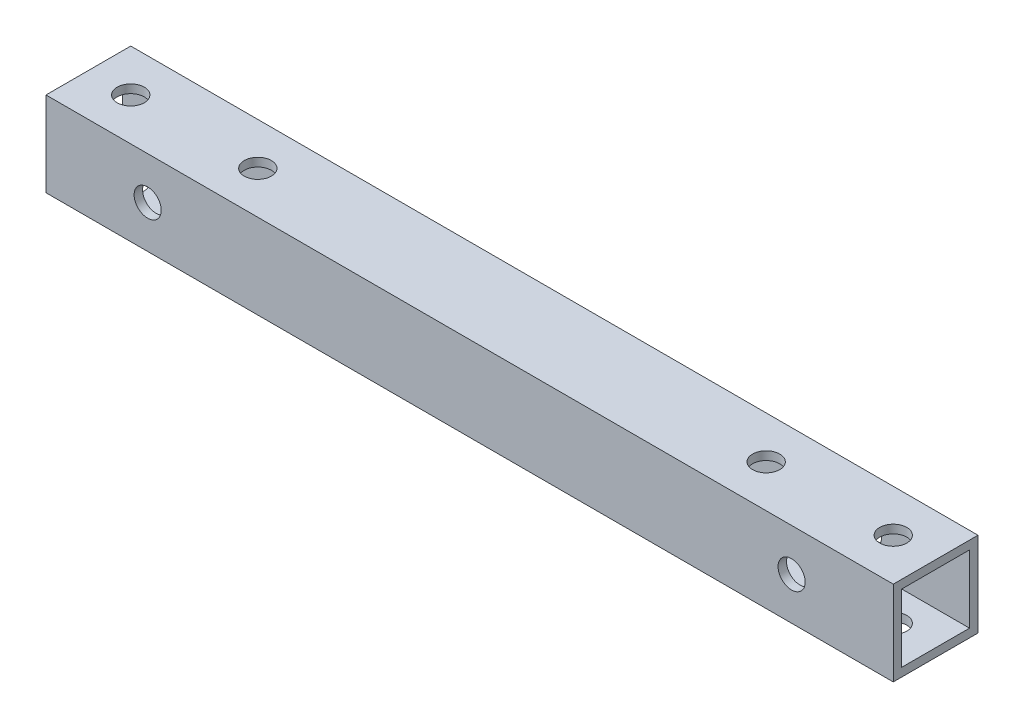
ISO-10303-21;
HEADER;
FILE_DESCRIPTION(('STEP AP214'),'2;1');
FILE_NAME('part.step','',(''),(''),'','','');
FILE_SCHEMA(('AUTOMOTIVE_DESIGN { 1 0 10303 214 1 1 1 1 }'));
ENDSEC;
DATA;
#1=APPLICATION_CONTEXT('core data for automotive mechanical design processes');
#2=APPLICATION_PROTOCOL_DEFINITION('international standard','automotive_design',2000,#1);
#3=PRODUCT_CONTEXT('',#1,'mechanical');
#4=PRODUCT('Part','Part','',(#3));
#5=PRODUCT_RELATED_PRODUCT_CATEGORY('part','',(#4));
#6=PRODUCT_DEFINITION_FORMATION('','',#4);
#7=PRODUCT_DEFINITION_CONTEXT('part definition',#1,'design');
#8=PRODUCT_DEFINITION('design','',#6,#7);
#9=PRODUCT_DEFINITION_SHAPE('','',#8);
#10=(LENGTH_UNIT() NAMED_UNIT(*) SI_UNIT(.MILLI.,.METRE.));
#11=(NAMED_UNIT(*) PLANE_ANGLE_UNIT() SI_UNIT($,.RADIAN.));
#12=(NAMED_UNIT(*) SI_UNIT($,.STERADIAN.) SOLID_ANGLE_UNIT());
#13=UNCERTAINTY_MEASURE_WITH_UNIT(LENGTH_MEASURE(1.E-05),#10,'distance_accuracy_value','');
#14=(GEOMETRIC_REPRESENTATION_CONTEXT(3) GLOBAL_UNCERTAINTY_ASSIGNED_CONTEXT((#13)) GLOBAL_UNIT_ASSIGNED_CONTEXT((#10,
#11,#12)) REPRESENTATION_CONTEXT('',''));
#15=CARTESIAN_POINT('',(0.,0.,0.));
#16=DIRECTION('',(0.,0.,1.));
#17=DIRECTION('',(1.,0.,0.));
#18=AXIS2_PLACEMENT_3D('',#15,#16,#17);
#19=CARTESIAN_POINT('',(50.,5.,-5.));
#20=DIRECTION('',(0.,0.,1.));
#21=DIRECTION('',(1.,0.,0.));
#22=AXIS2_PLACEMENT_3D('',#19,#20,#21);
#23=PLANE('',#22);
#24=CARTESIAN_POINT('',(-38.,0.,-5.));
#25=DIRECTION('',(0.,0.,1.));
#26=DIRECTION('',(1.,0.,0.));
#27=AXIS2_PLACEMENT_3D('',#24,#25,#26);
#28=CIRCLE('',#27,1.6);
#29=CARTESIAN_POINT('',(-36.4,0.,-5.));
#30=VERTEX_POINT('',#29);
#31=EDGE_CURVE('E185',#30,#30,#28,.T.);
#32=ORIENTED_EDGE('',*,*,#31,.T.);
#33=EDGE_LOOP('',(#32));
#34=FACE_BOUND('',#33,.T.);
#35=CARTESIAN_POINT('',(38.,0.,-5.));
#36=DIRECTION('',(0.,0.,1.));
#37=DIRECTION('',(-1.,0.,0.));
#38=AXIS2_PLACEMENT_3D('',#35,#36,#37);
#39=CIRCLE('',#38,1.6);
#40=CARTESIAN_POINT('',(36.4,0.,-5.));
#41=VERTEX_POINT('',#40);
#42=EDGE_CURVE('E196',#41,#41,#39,.T.);
#43=ORIENTED_EDGE('',*,*,#42,.T.);
#44=EDGE_LOOP('',(#43));
#45=FACE_BOUND('',#44,.T.);
#46=DIRECTION('',(0.,1.,0.));
#47=VECTOR('',#46,1.);
#48=CARTESIAN_POINT('',(-50.,5.,-5.));
#49=LINE('',#48,#47);
#50=CARTESIAN_POINT('',(-50.,-5.,-5.));
#51=VERTEX_POINT('',#50);
#52=CARTESIAN_POINT('',(-50.,5.,-5.));
#53=VERTEX_POINT('',#52);
#54=EDGE_CURVE('E138',#51,#53,#49,.T.);
#55=ORIENTED_EDGE('',*,*,#54,.T.);
#56=DIRECTION('',(-1.,0.,0.));
#57=VECTOR('',#56,1.);
#58=CARTESIAN_POINT('',(50.,5.,-5.));
#59=LINE('',#58,#57);
#60=CARTESIAN_POINT('',(50.,5.,-5.));
#61=VERTEX_POINT('',#60);
#62=EDGE_CURVE('E11',#61,#53,#59,.T.);
#63=ORIENTED_EDGE('',*,*,#62,.F.);
#64=DIRECTION('',(0.,1.,0.));
#65=VECTOR('',#64,1.);
#66=CARTESIAN_POINT('',(50.,5.,-5.));
#67=LINE('',#66,#65);
#68=CARTESIAN_POINT('',(50.,-5.,-5.));
#69=VERTEX_POINT('',#68);
#70=EDGE_CURVE('E142',#69,#61,#67,.T.);
#71=ORIENTED_EDGE('',*,*,#70,.F.);
#72=DIRECTION('',(-1.,0.,0.));
#73=VECTOR('',#72,1.);
#74=CARTESIAN_POINT('',(50.,-5.,-5.));
#75=LINE('',#74,#73);
#76=EDGE_CURVE('E152',#69,#51,#75,.T.);
#77=ORIENTED_EDGE('',*,*,#76,.T.);
#78=EDGE_LOOP('',(#55,#63,#71,#77));
#79=FACE_BOUND('',#78,.T.);
#80=ADVANCED_FACE('F36',(#34,#45,#79),#23,.F.);
#81=CARTESIAN_POINT('',(50.,5.,5.));
#82=DIRECTION('',(0.,-1.,0.));
#83=DIRECTION('',(0.,0.,-1.));
#84=AXIS2_PLACEMENT_3D('',#81,#82,#83);
#85=PLANE('',#84);
#86=CARTESIAN_POINT('',(-45.,5.,0.));
#87=DIRECTION('',(0.,1.,0.));
#88=DIRECTION('',(0.,0.,1.));
#89=AXIS2_PLACEMENT_3D('',#86,#87,#88);
#90=CIRCLE('',#89,1.60000000000001);
#91=CARTESIAN_POINT('',(-45.,5.,1.60000000000001));
#92=VERTEX_POINT('',#91);
#93=EDGE_CURVE('E210',#92,#92,#90,.T.);
#94=ORIENTED_EDGE('',*,*,#93,.F.);
#95=EDGE_LOOP('',(#94));
#96=FACE_BOUND('',#95,.T.);
#97=CARTESIAN_POINT('',(-30.,5.,0.));
#98=DIRECTION('',(0.,1.,0.));
#99=DIRECTION('',(0.,0.,1.));
#100=AXIS2_PLACEMENT_3D('',#97,#98,#99);
#101=CIRCLE('',#100,1.60000000000001);
#102=CARTESIAN_POINT('',(-30.,5.,1.60000000000001));
#103=VERTEX_POINT('',#102);
#104=EDGE_CURVE('E216',#103,#103,#101,.T.);
#105=ORIENTED_EDGE('',*,*,#104,.F.);
#106=EDGE_LOOP('',(#105));
#107=FACE_BOUND('',#106,.T.);
#108=CARTESIAN_POINT('',(30.,5.,0.));
#109=DIRECTION('',(0.,1.,0.));
#110=DIRECTION('',(0.,0.,-1.));
#111=AXIS2_PLACEMENT_3D('',#108,#109,#110);
#112=CIRCLE('',#111,1.60000000000001);
#113=CARTESIAN_POINT('',(30.,5.,-1.60000000000001));
#114=VERTEX_POINT('',#113);
#115=EDGE_CURVE('E222',#114,#114,#112,.T.);
#116=ORIENTED_EDGE('',*,*,#115,.F.);
#117=EDGE_LOOP('',(#116));
#118=FACE_BOUND('',#117,.T.);
#119=CARTESIAN_POINT('',(45.,5.,0.));
#120=DIRECTION('',(0.,1.,0.));
#121=DIRECTION('',(0.,0.,-1.));
#122=AXIS2_PLACEMENT_3D('',#119,#120,#121);
#123=CIRCLE('',#122,1.60000000000001);
#124=CARTESIAN_POINT('',(45.,5.,-1.60000000000001));
#125=VERTEX_POINT('',#124);
#126=EDGE_CURVE('E207',#125,#125,#123,.T.);
#127=ORIENTED_EDGE('',*,*,#126,.F.);
#128=EDGE_LOOP('',(#127));
#129=FACE_BOUND('',#128,.T.);
#130=DIRECTION('',(0.,0.,1.));
#131=VECTOR('',#130,1.);
#132=CARTESIAN_POINT('',(-50.,5.,5.));
#133=LINE('',#132,#131);
#134=CARTESIAN_POINT('',(-50.,5.,5.));
#135=VERTEX_POINT('',#134);
#136=EDGE_CURVE('E155',#53,#135,#133,.T.);
#137=ORIENTED_EDGE('',*,*,#136,.T.);
#138=DIRECTION('',(-1.,0.,0.));
#139=VECTOR('',#138,1.);
#140=CARTESIAN_POINT('',(50.,5.,5.));
#141=LINE('',#140,#139);
#142=CARTESIAN_POINT('',(50.,5.,5.));
#143=VERTEX_POINT('',#142);
#144=EDGE_CURVE('E44',#143,#135,#141,.T.);
#145=ORIENTED_EDGE('',*,*,#144,.F.);
#146=DIRECTION('',(0.,0.,1.));
#147=VECTOR('',#146,1.);
#148=CARTESIAN_POINT('',(50.,5.,5.));
#149=LINE('',#148,#147);
#150=EDGE_CURVE('E145',#61,#143,#149,.T.);
#151=ORIENTED_EDGE('',*,*,#150,.F.);
#152=ORIENTED_EDGE('',*,*,#62,.T.);
#153=EDGE_LOOP('',(#137,#145,#151,#152));
#154=FACE_BOUND('',#153,.T.);
#155=ADVANCED_FACE('F262',(#96,#107,#118,#129,#154),#85,.F.);
#156=CARTESIAN_POINT('',(50.,5.,5.));
#157=DIRECTION('',(0.,0.,-1.));
#158=DIRECTION('',(0.,1.,0.));
#159=AXIS2_PLACEMENT_3D('',#156,#157,#158);
#160=PLANE('',#159);
#161=CARTESIAN_POINT('',(-38.,0.,5.));
#162=DIRECTION('',(0.,0.,1.));
#163=DIRECTION('',(1.,0.,0.));
#164=AXIS2_PLACEMENT_3D('',#161,#162,#163);
#165=CIRCLE('',#164,1.6);
#166=CARTESIAN_POINT('',(-36.4,0.,5.));
#167=VERTEX_POINT('',#166);
#168=EDGE_CURVE('E191',#167,#167,#165,.T.);
#169=ORIENTED_EDGE('',*,*,#168,.F.);
#170=EDGE_LOOP('',(#169));
#171=FACE_BOUND('',#170,.T.);
#172=CARTESIAN_POINT('',(38.,0.,5.));
#173=DIRECTION('',(0.,0.,1.));
#174=DIRECTION('',(-1.,0.,0.));
#175=AXIS2_PLACEMENT_3D('',#172,#173,#174);
#176=CIRCLE('',#175,1.6);
#177=CARTESIAN_POINT('',(36.4,0.,5.));
#178=VERTEX_POINT('',#177);
#179=EDGE_CURVE('E201',#178,#178,#176,.T.);
#180=ORIENTED_EDGE('',*,*,#179,.F.);
#181=EDGE_LOOP('',(#180));
#182=FACE_BOUND('',#181,.T.);
#183=DIRECTION('',(0.,-1.,0.));
#184=VECTOR('',#183,1.);
#185=CARTESIAN_POINT('',(-50.,5.,5.));
#186=LINE('',#185,#184);
#187=CARTESIAN_POINT('',(-50.,-5.,5.));
#188=VERTEX_POINT('',#187);
#189=EDGE_CURVE('E157',#135,#188,#186,.T.);
#190=ORIENTED_EDGE('',*,*,#189,.T.);
#191=DIRECTION('',(-1.,0.,0.));
#192=VECTOR('',#191,1.);
#193=CARTESIAN_POINT('',(50.,-5.,5.));
#194=LINE('',#193,#192);
#195=CARTESIAN_POINT('',(50.,-5.,5.));
#196=VERTEX_POINT('',#195);
#197=EDGE_CURVE('E162',#196,#188,#194,.T.);
#198=ORIENTED_EDGE('',*,*,#197,.F.);
#199=DIRECTION('',(0.,-1.,0.));
#200=VECTOR('',#199,1.);
#201=CARTESIAN_POINT('',(50.,5.,5.));
#202=LINE('',#201,#200);
#203=EDGE_CURVE('E148',#143,#196,#202,.T.);
#204=ORIENTED_EDGE('',*,*,#203,.F.);
#205=ORIENTED_EDGE('',*,*,#144,.T.);
#206=EDGE_LOOP('',(#190,#198,#204,#205));
#207=FACE_BOUND('',#206,.T.);
#208=ADVANCED_FACE('F268',(#171,#182,#207),#160,.F.);
#209=CARTESIAN_POINT('',(50.,-5.,5.));
#210=DIRECTION('',(0.,1.,0.));
#211=DIRECTION('',(0.,0.,1.));
#212=AXIS2_PLACEMENT_3D('',#209,#210,#211);
#213=PLANE('',#212);
#214=CARTESIAN_POINT('',(-45.,-5.,0.));
#215=DIRECTION('',(0.,1.,0.));
#216=DIRECTION('',(0.,0.,1.));
#217=AXIS2_PLACEMENT_3D('',#214,#215,#216);
#218=CIRCLE('',#217,1.60000000000001);
#219=CARTESIAN_POINT('',(-45.,-5.,1.60000000000001));
#220=VERTEX_POINT('',#219);
#221=EDGE_CURVE('E171',#220,#220,#218,.T.);
#222=ORIENTED_EDGE('',*,*,#221,.T.);
#223=EDGE_LOOP('',(#222));
#224=FACE_BOUND('',#223,.T.);
#225=CARTESIAN_POINT('',(-30.,-5.,0.));
#226=DIRECTION('',(0.,1.,0.));
#227=DIRECTION('',(0.,0.,1.));
#228=AXIS2_PLACEMENT_3D('',#225,#226,#227);
#229=CIRCLE('',#228,1.60000000000001);
#230=CARTESIAN_POINT('',(-30.,-5.,1.60000000000001));
#231=VERTEX_POINT('',#230);
#232=EDGE_CURVE('E213',#231,#231,#229,.T.);
#233=ORIENTED_EDGE('',*,*,#232,.T.);
#234=EDGE_LOOP('',(#233));
#235=FACE_BOUND('',#234,.T.);
#236=CARTESIAN_POINT('',(30.,-5.,0.));
#237=DIRECTION('',(0.,1.,0.));
#238=DIRECTION('',(0.,0.,-1.));
#239=AXIS2_PLACEMENT_3D('',#236,#237,#238);
#240=CIRCLE('',#239,1.60000000000001);
#241=CARTESIAN_POINT('',(30.,-5.,-1.60000000000001));
#242=VERTEX_POINT('',#241);
#243=EDGE_CURVE('E219',#242,#242,#240,.T.);
#244=ORIENTED_EDGE('',*,*,#243,.T.);
#245=EDGE_LOOP('',(#244));
#246=FACE_BOUND('',#245,.T.);
#247=CARTESIAN_POINT('',(45.,-5.,0.));
#248=DIRECTION('',(0.,1.,0.));
#249=DIRECTION('',(0.,0.,-1.));
#250=AXIS2_PLACEMENT_3D('',#247,#248,#249);
#251=CIRCLE('',#250,1.60000000000001);
#252=CARTESIAN_POINT('',(45.,-5.,-1.60000000000001));
#253=VERTEX_POINT('',#252);
#254=EDGE_CURVE('E225',#253,#253,#251,.T.);
#255=ORIENTED_EDGE('',*,*,#254,.T.);
#256=EDGE_LOOP('',(#255));
#257=FACE_BOUND('',#256,.T.);
#258=DIRECTION('',(0.,0.,-1.));
#259=VECTOR('',#258,1.);
#260=CARTESIAN_POINT('',(-50.,-5.,5.));
#261=LINE('',#260,#259);
#262=EDGE_CURVE('E146',#188,#51,#261,.T.);
#263=ORIENTED_EDGE('',*,*,#262,.T.);
#264=ORIENTED_EDGE('',*,*,#76,.F.);
#265=DIRECTION('',(0.,0.,-1.));
#266=VECTOR('',#265,1.);
#267=CARTESIAN_POINT('',(50.,-5.,5.));
#268=LINE('',#267,#266);
#269=EDGE_CURVE('E150',#196,#69,#268,.T.);
#270=ORIENTED_EDGE('',*,*,#269,.F.);
#271=ORIENTED_EDGE('',*,*,#197,.T.);
#272=EDGE_LOOP('',(#263,#264,#270,#271));
#273=FACE_BOUND('',#272,.T.);
#274=ADVANCED_FACE('F287',(#224,#235,#246,#257,#273),#213,.F.);
#275=CARTESIAN_POINT('',(50.,0.,0.));
#276=DIRECTION('',(1.,0.,0.));
#277=DIRECTION('',(0.,0.,-1.));
#278=AXIS2_PLACEMENT_3D('',#275,#276,#277);
#279=PLANE('',#278);
#280=DIRECTION('',(0.,1.,0.));
#281=VECTOR('',#280,1.);
#282=CARTESIAN_POINT('',(50.,4.,-4.));
#283=LINE('',#282,#281);
#284=CARTESIAN_POINT('',(50.,-4.,-4.));
#285=VERTEX_POINT('',#284);
#286=CARTESIAN_POINT('',(50.,4.,-4.));
#287=VERTEX_POINT('',#286);
#288=EDGE_CURVE('E52',#285,#287,#283,.T.);
#289=ORIENTED_EDGE('',*,*,#288,.F.);
#290=DIRECTION('',(0.,0.,-1.));
#291=VECTOR('',#290,1.);
#292=CARTESIAN_POINT('',(50.,-4.,4.));
#293=LINE('',#292,#291);
#294=CARTESIAN_POINT('',(50.,-4.,4.));
#295=VERTEX_POINT('',#294);
#296=EDGE_CURVE('E120',#295,#285,#293,.T.);
#297=ORIENTED_EDGE('',*,*,#296,.F.);
#298=DIRECTION('',(0.,-1.,0.));
#299=VECTOR('',#298,1.);
#300=CARTESIAN_POINT('',(50.,4.,4.));
#301=LINE('',#300,#299);
#302=CARTESIAN_POINT('',(50.,4.,4.));
#303=VERTEX_POINT('',#302);
#304=EDGE_CURVE('E123',#303,#295,#301,.T.);
#305=ORIENTED_EDGE('',*,*,#304,.F.);
#306=DIRECTION('',(0.,0.,1.));
#307=VECTOR('',#306,1.);
#308=CARTESIAN_POINT('',(50.,4.,4.));
#309=LINE('',#308,#307);
#310=EDGE_CURVE('E132',#287,#303,#309,.T.);
#311=ORIENTED_EDGE('',*,*,#310,.F.);
#312=EDGE_LOOP('',(#289,#297,#305,#311));
#313=FACE_BOUND('',#312,.T.);
#314=ORIENTED_EDGE('',*,*,#70,.T.);
#315=ORIENTED_EDGE('',*,*,#150,.T.);
#316=ORIENTED_EDGE('',*,*,#203,.T.);
#317=ORIENTED_EDGE('',*,*,#269,.T.);
#318=EDGE_LOOP('',(#314,#315,#316,#317));
#319=FACE_BOUND('',#318,.T.);
#320=ADVANCED_FACE('F283',(#313,#319),#279,.T.);
#321=CARTESIAN_POINT('',(-50.,0.,0.));
#322=DIRECTION('',(1.,0.,0.));
#323=DIRECTION('',(0.,0.,-1.));
#324=AXIS2_PLACEMENT_3D('',#321,#322,#323);
#325=PLANE('',#324);
#326=DIRECTION('',(0.,0.,-1.));
#327=VECTOR('',#326,1.);
#328=CARTESIAN_POINT('',(-50.,-4.,4.));
#329=LINE('',#328,#327);
#330=CARTESIAN_POINT('',(-50.,-4.,4.));
#331=VERTEX_POINT('',#330);
#332=CARTESIAN_POINT('',(-50.,-4.,-4.));
#333=VERTEX_POINT('',#332);
#334=EDGE_CURVE('E110',#331,#333,#329,.T.);
#335=ORIENTED_EDGE('',*,*,#334,.T.);
#336=DIRECTION('',(0.,1.,0.));
#337=VECTOR('',#336,1.);
#338=CARTESIAN_POINT('',(-50.,4.,-4.));
#339=LINE('',#338,#337);
#340=CARTESIAN_POINT('',(-50.,4.,-4.));
#341=VERTEX_POINT('',#340);
#342=EDGE_CURVE('E104',#333,#341,#339,.T.);
#343=ORIENTED_EDGE('',*,*,#342,.T.);
#344=DIRECTION('',(0.,0.,1.));
#345=VECTOR('',#344,1.);
#346=CARTESIAN_POINT('',(-50.,4.,4.));
#347=LINE('',#346,#345);
#348=CARTESIAN_POINT('',(-50.,4.,4.));
#349=VERTEX_POINT('',#348);
#350=EDGE_CURVE('E113',#341,#349,#347,.T.);
#351=ORIENTED_EDGE('',*,*,#350,.T.);
#352=DIRECTION('',(0.,-1.,0.));
#353=VECTOR('',#352,1.);
#354=CARTESIAN_POINT('',(-50.,4.,4.));
#355=LINE('',#354,#353);
#356=EDGE_CURVE('E60',#349,#331,#355,.T.);
#357=ORIENTED_EDGE('',*,*,#356,.T.);
#358=EDGE_LOOP('',(#335,#343,#351,#357));
#359=FACE_BOUND('',#358,.T.);
#360=ORIENTED_EDGE('',*,*,#54,.F.);
#361=ORIENTED_EDGE('',*,*,#262,.F.);
#362=ORIENTED_EDGE('',*,*,#189,.F.);
#363=ORIENTED_EDGE('',*,*,#136,.F.);
#364=EDGE_LOOP('',(#360,#361,#362,#363));
#365=FACE_BOUND('',#364,.T.);
#366=ADVANCED_FACE('F117',(#359,#365),#325,.F.);
#367=CARTESIAN_POINT('',(-50.,4.,-4.));
#368=DIRECTION('',(0.,0.,-1.));
#369=DIRECTION('',(-1.,0.,0.));
#370=AXIS2_PLACEMENT_3D('',#367,#368,#369);
#371=PLANE('',#370);
#372=CARTESIAN_POINT('',(-38.,0.,-4.));
#373=DIRECTION('',(0.,0.,-1.));
#374=DIRECTION('',(-1.,0.,0.));
#375=AXIS2_PLACEMENT_3D('',#372,#373,#374);
#376=CIRCLE('',#375,1.6);
#377=CARTESIAN_POINT('',(-39.6,0.,-4.));
#378=VERTEX_POINT('',#377);
#379=EDGE_CURVE('E204',#378,#378,#376,.T.);
#380=ORIENTED_EDGE('',*,*,#379,.T.);
#381=EDGE_LOOP('',(#380));
#382=FACE_BOUND('',#381,.T.);
#383=CARTESIAN_POINT('',(38.,0.,-4.));
#384=DIRECTION('',(0.,0.,-1.));
#385=DIRECTION('',(-1.,0.,0.));
#386=AXIS2_PLACEMENT_3D('',#383,#384,#385);
#387=CIRCLE('',#386,1.6);
#388=CARTESIAN_POINT('',(36.4,0.,-4.));
#389=VERTEX_POINT('',#388);
#390=EDGE_CURVE('E184',#389,#389,#387,.T.);
#391=ORIENTED_EDGE('',*,*,#390,.T.);
#392=EDGE_LOOP('',(#391));
#393=FACE_BOUND('',#392,.T.);
#394=ORIENTED_EDGE('',*,*,#288,.T.);
#395=DIRECTION('',(1.,0.,0.));
#396=VECTOR('',#395,1.);
#397=CARTESIAN_POINT('',(-50.,4.,-4.));
#398=LINE('',#397,#396);
#399=EDGE_CURVE('E100',#341,#287,#398,.T.);
#400=ORIENTED_EDGE('',*,*,#399,.F.);
#401=ORIENTED_EDGE('',*,*,#342,.F.);
#402=DIRECTION('',(1.,0.,0.));
#403=VECTOR('',#402,1.);
#404=CARTESIAN_POINT('',(-50.,-4.,-4.));
#405=LINE('',#404,#403);
#406=EDGE_CURVE('E136',#333,#285,#405,.T.);
#407=ORIENTED_EDGE('',*,*,#406,.T.);
#408=EDGE_LOOP('',(#394,#400,#401,#407));
#409=FACE_BOUND('',#408,.T.);
#410=ADVANCED_FACE('F102',(#382,#393,#409),#371,.F.);
#411=CARTESIAN_POINT('',(-50.,-4.,4.));
#412=DIRECTION('',(0.,-1.,0.));
#413=DIRECTION('',(0.,0.,-1.));
#414=AXIS2_PLACEMENT_3D('',#411,#412,#413);
#415=PLANE('',#414);
#416=CARTESIAN_POINT('',(-45.,-4.,0.));
#417=DIRECTION('',(0.,-1.,0.));
#418=DIRECTION('',(0.,0.,-1.));
#419=AXIS2_PLACEMENT_3D('',#416,#417,#418);
#420=CIRCLE('',#419,1.60000000000001);
#421=CARTESIAN_POINT('',(-45.,-4.,-1.60000000000001));
#422=VERTEX_POINT('',#421);
#423=EDGE_CURVE('E126',#422,#422,#420,.T.);
#424=ORIENTED_EDGE('',*,*,#423,.T.);
#425=EDGE_LOOP('',(#424));
#426=FACE_BOUND('',#425,.T.);
#427=CARTESIAN_POINT('',(-30.,-4.,0.));
#428=DIRECTION('',(0.,-1.,0.));
#429=DIRECTION('',(0.,0.,-1.));
#430=AXIS2_PLACEMENT_3D('',#427,#428,#429);
#431=CIRCLE('',#430,1.60000000000001);
#432=CARTESIAN_POINT('',(-30.,-4.,-1.60000000000001));
#433=VERTEX_POINT('',#432);
#434=EDGE_CURVE('E179',#433,#433,#431,.T.);
#435=ORIENTED_EDGE('',*,*,#434,.T.);
#436=EDGE_LOOP('',(#435));
#437=FACE_BOUND('',#436,.T.);
#438=CARTESIAN_POINT('',(30.,-4.,0.));
#439=DIRECTION('',(0.,-1.,0.));
#440=DIRECTION('',(0.,0.,-1.));
#441=AXIS2_PLACEMENT_3D('',#438,#439,#440);
#442=CIRCLE('',#441,1.60000000000001);
#443=CARTESIAN_POINT('',(30.,-4.,-1.60000000000001));
#444=VERTEX_POINT('',#443);
#445=EDGE_CURVE('E175',#444,#444,#442,.T.);
#446=ORIENTED_EDGE('',*,*,#445,.T.);
#447=EDGE_LOOP('',(#446));
#448=FACE_BOUND('',#447,.T.);
#449=CARTESIAN_POINT('',(45.,-4.,0.));
#450=DIRECTION('',(0.,-1.,0.));
#451=DIRECTION('',(0.,0.,-1.));
#452=AXIS2_PLACEMENT_3D('',#449,#450,#451);
#453=CIRCLE('',#452,1.60000000000001);
#454=CARTESIAN_POINT('',(45.,-4.,-1.60000000000001));
#455=VERTEX_POINT('',#454);
#456=EDGE_CURVE('E170',#455,#455,#453,.T.);
#457=ORIENTED_EDGE('',*,*,#456,.T.);
#458=EDGE_LOOP('',(#457));
#459=FACE_BOUND('',#458,.T.);
#460=ORIENTED_EDGE('',*,*,#296,.T.);
#461=ORIENTED_EDGE('',*,*,#406,.F.);
#462=ORIENTED_EDGE('',*,*,#334,.F.);
#463=DIRECTION('',(1.,0.,0.));
#464=VECTOR('',#463,1.);
#465=CARTESIAN_POINT('',(-50.,-4.,4.));
#466=LINE('',#465,#464);
#467=EDGE_CURVE('E139',#331,#295,#466,.T.);
#468=ORIENTED_EDGE('',*,*,#467,.T.);
#469=EDGE_LOOP('',(#460,#461,#462,#468));
#470=FACE_BOUND('',#469,.T.);
#471=ADVANCED_FACE('F236',(#426,#437,#448,#459,#470),#415,.F.);
#472=CARTESIAN_POINT('',(-50.,4.,4.));
#473=DIRECTION('',(0.,0.,1.));
#474=DIRECTION('',(1.,0.,0.));
#475=AXIS2_PLACEMENT_3D('',#472,#473,#474);
#476=PLANE('',#475);
#477=CARTESIAN_POINT('',(-38.,0.,4.));
#478=DIRECTION('',(0.,0.,1.));
#479=DIRECTION('',(1.,0.,0.));
#480=AXIS2_PLACEMENT_3D('',#477,#478,#479);
#481=CIRCLE('',#480,1.6);
#482=CARTESIAN_POINT('',(-36.4,0.,4.));
#483=VERTEX_POINT('',#482);
#484=EDGE_CURVE('E39',#483,#483,#481,.T.);
#485=ORIENTED_EDGE('',*,*,#484,.T.);
#486=EDGE_LOOP('',(#485));
#487=FACE_BOUND('',#486,.T.);
#488=CARTESIAN_POINT('',(38.,0.,4.));
#489=DIRECTION('',(0.,0.,1.));
#490=DIRECTION('',(1.,0.,0.));
#491=AXIS2_PLACEMENT_3D('',#488,#489,#490);
#492=CIRCLE('',#491,1.6);
#493=CARTESIAN_POINT('',(39.6,0.,4.));
#494=VERTEX_POINT('',#493);
#495=EDGE_CURVE('E182',#494,#494,#492,.T.);
#496=ORIENTED_EDGE('',*,*,#495,.T.);
#497=EDGE_LOOP('',(#496));
#498=FACE_BOUND('',#497,.T.);
#499=ORIENTED_EDGE('',*,*,#304,.T.);
#500=ORIENTED_EDGE('',*,*,#467,.F.);
#501=ORIENTED_EDGE('',*,*,#356,.F.);
#502=DIRECTION('',(1.,0.,0.));
#503=VECTOR('',#502,1.);
#504=CARTESIAN_POINT('',(-50.,4.,4.));
#505=LINE('',#504,#503);
#506=EDGE_CURVE('E109',#349,#303,#505,.T.);
#507=ORIENTED_EDGE('',*,*,#506,.T.);
#508=EDGE_LOOP('',(#499,#500,#501,#507));
#509=FACE_BOUND('',#508,.T.);
#510=ADVANCED_FACE('F310',(#487,#498,#509),#476,.F.);
#511=CARTESIAN_POINT('',(-50.,4.,4.));
#512=DIRECTION('',(0.,1.,0.));
#513=DIRECTION('',(0.,0.,1.));
#514=AXIS2_PLACEMENT_3D('',#511,#512,#513);
#515=PLANE('',#514);
#516=CARTESIAN_POINT('',(-45.,4.,0.));
#517=DIRECTION('',(0.,1.,0.));
#518=DIRECTION('',(0.,0.,1.));
#519=AXIS2_PLACEMENT_3D('',#516,#517,#518);
#520=CIRCLE('',#519,1.60000000000001);
#521=CARTESIAN_POINT('',(-45.,4.,1.60000000000001));
#522=VERTEX_POINT('',#521);
#523=EDGE_CURVE('E180',#522,#522,#520,.T.);
#524=ORIENTED_EDGE('',*,*,#523,.T.);
#525=EDGE_LOOP('',(#524));
#526=FACE_BOUND('',#525,.T.);
#527=CARTESIAN_POINT('',(-30.,4.,0.));
#528=DIRECTION('',(0.,1.,0.));
#529=DIRECTION('',(0.,0.,1.));
#530=AXIS2_PLACEMENT_3D('',#527,#528,#529);
#531=CIRCLE('',#530,1.60000000000001);
#532=CARTESIAN_POINT('',(-30.,4.,1.60000000000001));
#533=VERTEX_POINT('',#532);
#534=EDGE_CURVE('E176',#533,#533,#531,.T.);
#535=ORIENTED_EDGE('',*,*,#534,.T.);
#536=EDGE_LOOP('',(#535));
#537=FACE_BOUND('',#536,.T.);
#538=CARTESIAN_POINT('',(30.,4.,0.));
#539=DIRECTION('',(0.,1.,0.));
#540=DIRECTION('',(0.,0.,1.));
#541=AXIS2_PLACEMENT_3D('',#538,#539,#540);
#542=CIRCLE('',#541,1.60000000000001);
#543=CARTESIAN_POINT('',(30.,4.,1.60000000000001));
#544=VERTEX_POINT('',#543);
#545=EDGE_CURVE('E172',#544,#544,#542,.T.);
#546=ORIENTED_EDGE('',*,*,#545,.T.);
#547=EDGE_LOOP('',(#546));
#548=FACE_BOUND('',#547,.T.);
#549=CARTESIAN_POINT('',(45.,4.,0.));
#550=DIRECTION('',(0.,1.,0.));
#551=DIRECTION('',(0.,0.,1.));
#552=AXIS2_PLACEMENT_3D('',#549,#550,#551);
#553=CIRCLE('',#552,1.60000000000001);
#554=CARTESIAN_POINT('',(45.,4.,1.60000000000001));
#555=VERTEX_POINT('',#554);
#556=EDGE_CURVE('E167',#555,#555,#553,.T.);
#557=ORIENTED_EDGE('',*,*,#556,.T.);
#558=EDGE_LOOP('',(#557));
#559=FACE_BOUND('',#558,.T.);
#560=ORIENTED_EDGE('',*,*,#310,.T.);
#561=ORIENTED_EDGE('',*,*,#506,.F.);
#562=ORIENTED_EDGE('',*,*,#350,.F.);
#563=ORIENTED_EDGE('',*,*,#399,.T.);
#564=EDGE_LOOP('',(#560,#561,#562,#563));
#565=FACE_BOUND('',#564,.T.);
#566=ADVANCED_FACE('F114',(#526,#537,#548,#559,#565),#515,.F.);
#567=CARTESIAN_POINT('',(45.,-5.,0.));
#568=DIRECTION('',(0.,1.,0.));
#569=DIRECTION('',(0.,0.,1.));
#570=AXIS2_PLACEMENT_3D('',#567,#568,#569);
#571=CYLINDRICAL_SURFACE('',#570,1.60000000000001);
#572=ORIENTED_EDGE('',*,*,#126,.T.);
#573=EDGE_LOOP('',(#572));
#574=FACE_BOUND('',#573,.T.);
#575=ORIENTED_EDGE('',*,*,#556,.F.);
#576=EDGE_LOOP('',(#575));
#577=FACE_BOUND('',#576,.T.);
#578=ADVANCED_FACE('F309',(#574,#577),#571,.F.);
#579=CARTESIAN_POINT('',(30.,-5.,0.));
#580=DIRECTION('',(0.,1.,0.));
#581=DIRECTION('',(0.,0.,1.));
#582=AXIS2_PLACEMENT_3D('',#579,#580,#581);
#583=CYLINDRICAL_SURFACE('',#582,1.60000000000001);
#584=ORIENTED_EDGE('',*,*,#115,.T.);
#585=EDGE_LOOP('',(#584));
#586=FACE_BOUND('',#585,.T.);
#587=ORIENTED_EDGE('',*,*,#545,.F.);
#588=EDGE_LOOP('',(#587));
#589=FACE_BOUND('',#588,.T.);
#590=ADVANCED_FACE('F257',(#586,#589),#583,.F.);
#591=CARTESIAN_POINT('',(-30.,-5.,0.));
#592=DIRECTION('',(0.,1.,0.));
#593=DIRECTION('',(0.,0.,1.));
#594=AXIS2_PLACEMENT_3D('',#591,#592,#593);
#595=CYLINDRICAL_SURFACE('',#594,1.60000000000001);
#596=ORIENTED_EDGE('',*,*,#104,.T.);
#597=EDGE_LOOP('',(#596));
#598=FACE_BOUND('',#597,.T.);
#599=ORIENTED_EDGE('',*,*,#534,.F.);
#600=EDGE_LOOP('',(#599));
#601=FACE_BOUND('',#600,.T.);
#602=ADVANCED_FACE('F245',(#598,#601),#595,.F.);
#603=CARTESIAN_POINT('',(-45.,-5.,0.));
#604=DIRECTION('',(0.,1.,0.));
#605=DIRECTION('',(0.,0.,1.));
#606=AXIS2_PLACEMENT_3D('',#603,#604,#605);
#607=CYLINDRICAL_SURFACE('',#606,1.60000000000001);
#608=ORIENTED_EDGE('',*,*,#93,.T.);
#609=EDGE_LOOP('',(#608));
#610=FACE_BOUND('',#609,.T.);
#611=ORIENTED_EDGE('',*,*,#523,.F.);
#612=EDGE_LOOP('',(#611));
#613=FACE_BOUND('',#612,.T.);
#614=ADVANCED_FACE('F253',(#610,#613),#607,.F.);
#615=ORIENTED_EDGE('',*,*,#254,.F.);
#616=EDGE_LOOP('',(#615));
#617=FACE_BOUND('',#616,.T.);
#618=ORIENTED_EDGE('',*,*,#456,.F.);
#619=EDGE_LOOP('',(#618));
#620=FACE_BOUND('',#619,.T.);
#621=ADVANCED_FACE('F254',(#617,#620),#571,.F.);
#622=ORIENTED_EDGE('',*,*,#243,.F.);
#623=EDGE_LOOP('',(#622));
#624=FACE_BOUND('',#623,.T.);
#625=ORIENTED_EDGE('',*,*,#445,.F.);
#626=EDGE_LOOP('',(#625));
#627=FACE_BOUND('',#626,.T.);
#628=ADVANCED_FACE('F242',(#624,#627),#583,.F.);
#629=ORIENTED_EDGE('',*,*,#232,.F.);
#630=EDGE_LOOP('',(#629));
#631=FACE_BOUND('',#630,.T.);
#632=ORIENTED_EDGE('',*,*,#434,.F.);
#633=EDGE_LOOP('',(#632));
#634=FACE_BOUND('',#633,.T.);
#635=ADVANCED_FACE('F239',(#631,#634),#595,.F.);
#636=ORIENTED_EDGE('',*,*,#221,.F.);
#637=EDGE_LOOP('',(#636));
#638=FACE_BOUND('',#637,.T.);
#639=ORIENTED_EDGE('',*,*,#423,.F.);
#640=EDGE_LOOP('',(#639));
#641=FACE_BOUND('',#640,.T.);
#642=ADVANCED_FACE('F241',(#638,#641),#607,.F.);
#643=CARTESIAN_POINT('',(38.,0.,-5.));
#644=DIRECTION('',(0.,0.,1.));
#645=DIRECTION('',(1.,0.,0.));
#646=AXIS2_PLACEMENT_3D('',#643,#644,#645);
#647=CYLINDRICAL_SURFACE('',#646,1.6);
#648=ORIENTED_EDGE('',*,*,#179,.T.);
#649=EDGE_LOOP('',(#648));
#650=FACE_BOUND('',#649,.T.);
#651=ORIENTED_EDGE('',*,*,#495,.F.);
#652=EDGE_LOOP('',(#651));
#653=FACE_BOUND('',#652,.T.);
#654=ADVANCED_FACE('F250',(#650,#653),#647,.F.);
#655=CARTESIAN_POINT('',(-38.,0.,-5.));
#656=DIRECTION('',(0.,0.,1.));
#657=DIRECTION('',(1.,0.,0.));
#658=AXIS2_PLACEMENT_3D('',#655,#656,#657);
#659=CYLINDRICAL_SURFACE('',#658,1.6);
#660=ORIENTED_EDGE('',*,*,#168,.T.);
#661=EDGE_LOOP('',(#660));
#662=FACE_BOUND('',#661,.T.);
#663=ORIENTED_EDGE('',*,*,#484,.F.);
#664=EDGE_LOOP('',(#663));
#665=FACE_BOUND('',#664,.T.);
#666=ADVANCED_FACE('F380',(#662,#665),#659,.F.);
#667=ORIENTED_EDGE('',*,*,#42,.F.);
#668=EDGE_LOOP('',(#667));
#669=FACE_BOUND('',#668,.T.);
#670=ORIENTED_EDGE('',*,*,#390,.F.);
#671=EDGE_LOOP('',(#670));
#672=FACE_BOUND('',#671,.T.);
#673=ADVANCED_FACE('F383',(#669,#672),#647,.F.);
#674=ORIENTED_EDGE('',*,*,#31,.F.);
#675=EDGE_LOOP('',(#674));
#676=FACE_BOUND('',#675,.T.);
#677=ORIENTED_EDGE('',*,*,#379,.F.);
#678=EDGE_LOOP('',(#677));
#679=FACE_BOUND('',#678,.T.);
#680=ADVANCED_FACE('F390',(#676,#679),#659,.F.);
#681=CLOSED_SHELL('',(#80,#155,#208,#274,#320,#366,#410,#471,#510,#566,#578,#590,#602,#614,#621,
#628,#635,#642,#654,#666,#673,#680));
#682=MANIFOLD_SOLID_BREP('B2',#681);
#683=ADVANCED_BREP_SHAPE_REPRESENTATION('',(#18,#682),#14);
#684=SHAPE_DEFINITION_REPRESENTATION(#9,#683);
ENDSEC;
END-ISO-10303-21;
